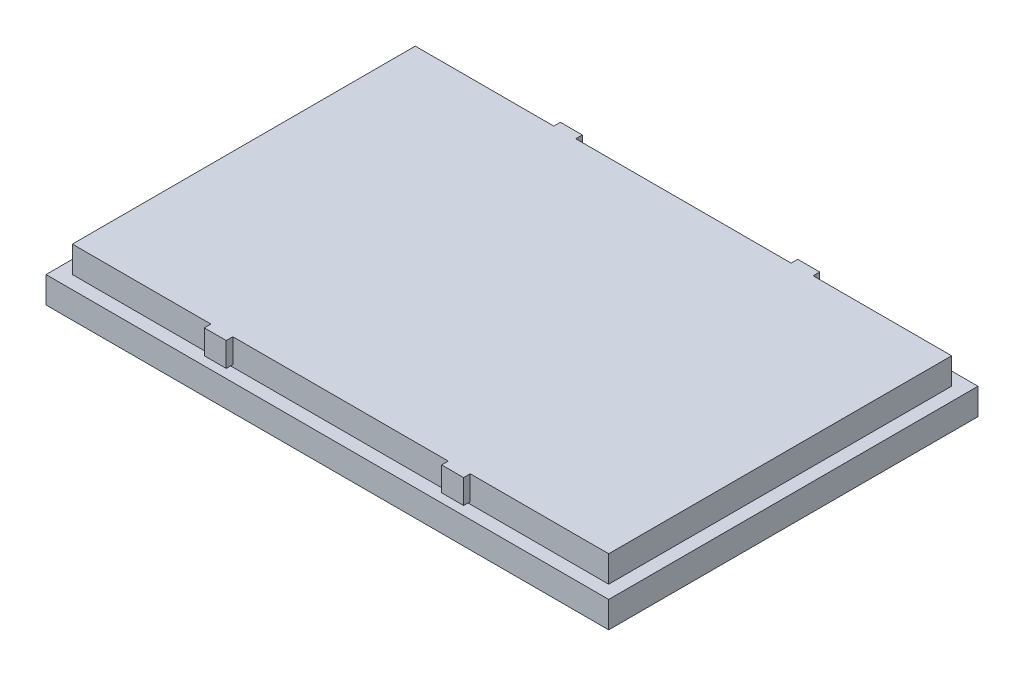
ISO-10303-21;
HEADER;
FILE_DESCRIPTION(('STEP AP214'),'2;1');
FILE_NAME('part.step','',(''),(''),'','','');
FILE_SCHEMA(('AUTOMOTIVE_DESIGN { 1 0 10303 214 1 1 1 1 }'));
ENDSEC;
DATA;
#1=APPLICATION_CONTEXT('core data for automotive mechanical design processes');
#2=APPLICATION_PROTOCOL_DEFINITION('international standard','automotive_design',2000,#1);
#3=PRODUCT_CONTEXT('',#1,'mechanical');
#4=PRODUCT('Part','Part','',(#3));
#5=PRODUCT_RELATED_PRODUCT_CATEGORY('part','',(#4));
#6=PRODUCT_DEFINITION_FORMATION('','',#4);
#7=PRODUCT_DEFINITION_CONTEXT('part definition',#1,'design');
#8=PRODUCT_DEFINITION('design','',#6,#7);
#9=PRODUCT_DEFINITION_SHAPE('','',#8);
#10=(LENGTH_UNIT() NAMED_UNIT(*) SI_UNIT(.MILLI.,.METRE.));
#11=(NAMED_UNIT(*) PLANE_ANGLE_UNIT() SI_UNIT($,.RADIAN.));
#12=(NAMED_UNIT(*) SI_UNIT($,.STERADIAN.) SOLID_ANGLE_UNIT());
#13=UNCERTAINTY_MEASURE_WITH_UNIT(LENGTH_MEASURE(1.E-05),#10,'distance_accuracy_value','');
#14=(GEOMETRIC_REPRESENTATION_CONTEXT(3) GLOBAL_UNCERTAINTY_ASSIGNED_CONTEXT((#13)) GLOBAL_UNIT_ASSIGNED_CONTEXT((#10,
#11,#12)) REPRESENTATION_CONTEXT('',''));
#15=CARTESIAN_POINT('',(0.,0.,0.));
#16=DIRECTION('',(0.,0.,1.));
#17=DIRECTION('',(1.,0.,0.));
#18=AXIS2_PLACEMENT_3D('',#15,#16,#17);
#19=CARTESIAN_POINT('',(14.,0.,-55.6));
#20=DIRECTION('',(0.,1.,0.));
#21=DIRECTION('',(0.,0.,1.));
#22=AXIS2_PLACEMENT_3D('',#19,#20,#21);
#23=PLANE('',#22);
#24=DIRECTION('',(0.,0.,-1.));
#25=VECTOR('',#24,1.);
#26=CARTESIAN_POINT('',(25.3,0.,-55.6));
#27=LINE('',#26,#25);
#28=CARTESIAN_POINT('',(25.3,0.,-71.6));
#29=VERTEX_POINT('',#28);
#30=CARTESIAN_POINT('',(25.3,0.,-72.4));
#31=VERTEX_POINT('',#30);
#32=EDGE_CURVE('E263',#29,#31,#27,.T.);
#33=ORIENTED_EDGE('',*,*,#32,.F.);
#34=DIRECTION('',(-1.,0.,0.));
#35=VECTOR('',#34,1.);
#36=CARTESIAN_POINT('',(14.,0.,-71.6));
#37=LINE('',#36,#35);
#38=CARTESIAN_POINT('',(28.3,0.,-71.6));
#39=VERTEX_POINT('',#38);
#40=EDGE_CURVE('E11',#39,#29,#37,.T.);
#41=ORIENTED_EDGE('',*,*,#40,.F.);
#42=DIRECTION('',(0.,0.,1.));
#43=VECTOR('',#42,1.);
#44=CARTESIAN_POINT('',(28.3,0.,-55.6));
#45=LINE('',#44,#43);
#46=CARTESIAN_POINT('',(28.3,0.,-72.4));
#47=VERTEX_POINT('',#46);
#48=EDGE_CURVE('E239',#47,#39,#45,.T.);
#49=ORIENTED_EDGE('',*,*,#48,.F.);
#50=DIRECTION('',(1.,0.,0.));
#51=VECTOR('',#50,1.);
#52=CARTESIAN_POINT('',(14.,0.,-72.4));
#53=LINE('',#52,#51);
#54=CARTESIAN_POINT('',(39.6,0.,-72.4));
#55=VERTEX_POINT('',#54);
#56=EDGE_CURVE('E463',#47,#55,#53,.T.);
#57=ORIENTED_EDGE('',*,*,#56,.T.);
#58=DIRECTION('',(0.,0.,-1.));
#59=VECTOR('',#58,1.);
#60=CARTESIAN_POINT('',(39.6,0.,-55.6));
#61=LINE('',#60,#59);
#62=CARTESIAN_POINT('',(39.6,0.,-55.6));
#63=VERTEX_POINT('',#62);
#64=EDGE_CURVE('E480',#63,#55,#61,.T.);
#65=ORIENTED_EDGE('',*,*,#64,.F.);
#66=DIRECTION('',(1.,0.,0.));
#67=VECTOR('',#66,1.);
#68=CARTESIAN_POINT('',(14.,0.,-55.6));
#69=LINE('',#68,#67);
#70=CARTESIAN_POINT('',(14.,0.,-55.6));
#71=VERTEX_POINT('',#70);
#72=EDGE_CURVE('E449',#71,#63,#69,.T.);
#73=ORIENTED_EDGE('',*,*,#72,.F.);
#74=DIRECTION('',(0.,0.,-1.));
#75=VECTOR('',#74,1.);
#76=CARTESIAN_POINT('',(14.,0.,-55.6));
#77=LINE('',#76,#75);
#78=CARTESIAN_POINT('',(14.,0.,-72.4));
#79=VERTEX_POINT('',#78);
#80=EDGE_CURVE('E484',#71,#79,#77,.T.);
#81=ORIENTED_EDGE('',*,*,#80,.T.);
#82=EDGE_CURVE('E464',#79,#31,#53,.T.);
#83=ORIENTED_EDGE('',*,*,#82,.T.);
#84=EDGE_LOOP('',(#33,#41,#49,#57,#65,#73,#81,#83));
#85=FACE_BOUND('',#84,.T.);
#86=ADVANCED_FACE('F47',(#85),#23,.F.);
#87=CARTESIAN_POINT('',(0.,0.,-72.4));
#88=DIRECTION('',(0.,0.,-1.));
#89=DIRECTION('',(-1.,0.,0.));
#90=AXIS2_PLACEMENT_3D('',#87,#88,#89);
#91=PLANE('',#90);
#92=DIRECTION('',(-1.,0.,0.));
#93=VECTOR('',#92,1.);
#94=CARTESIAN_POINT('',(0.,0.6,-72.4));
#95=LINE('',#94,#93);
#96=CARTESIAN_POINT('',(28.3,0.6,-72.4));
#97=VERTEX_POINT('',#96);
#98=CARTESIAN_POINT('',(25.3,0.6,-72.4));
#99=VERTEX_POINT('',#98);
#100=EDGE_CURVE('E249',#97,#99,#95,.T.);
#101=ORIENTED_EDGE('',*,*,#100,.T.);
#102=DIRECTION('',(0.,-1.,0.));
#103=VECTOR('',#102,1.);
#104=CARTESIAN_POINT('',(25.3,0.,-72.4));
#105=LINE('',#104,#103);
#106=EDGE_CURVE('E56',#99,#31,#105,.T.);
#107=ORIENTED_EDGE('',*,*,#106,.T.);
#108=ORIENTED_EDGE('',*,*,#82,.F.);
#109=DIRECTION('',(0.,-1.,0.));
#110=VECTOR('',#109,1.);
#111=CARTESIAN_POINT('',(14.,0.,-72.4));
#112=LINE('',#111,#110);
#113=CARTESIAN_POINT('',(14.,1.2,-72.4));
#114=VERTEX_POINT('',#113);
#115=EDGE_CURVE('E444',#114,#79,#112,.T.);
#116=ORIENTED_EDGE('',*,*,#115,.F.);
#117=DIRECTION('',(-1.,0.,0.));
#118=VECTOR('',#117,1.);
#119=CARTESIAN_POINT('',(14.,1.2,-72.4));
#120=LINE('',#119,#118);
#121=CARTESIAN_POINT('',(39.6,1.2,-72.4));
#122=VERTEX_POINT('',#121);
#123=EDGE_CURVE('E450',#122,#114,#120,.T.);
#124=ORIENTED_EDGE('',*,*,#123,.F.);
#125=DIRECTION('',(0.,1.,0.));
#126=VECTOR('',#125,1.);
#127=CARTESIAN_POINT('',(39.6,0.,-72.4));
#128=LINE('',#127,#126);
#129=EDGE_CURVE('E468',#55,#122,#128,.T.);
#130=ORIENTED_EDGE('',*,*,#129,.F.);
#131=ORIENTED_EDGE('',*,*,#56,.F.);
#132=DIRECTION('',(0.,1.,0.));
#133=VECTOR('',#132,1.);
#134=CARTESIAN_POINT('',(28.3,0.,-72.4));
#135=LINE('',#134,#133);
#136=EDGE_CURVE('E518',#47,#97,#135,.T.);
#137=ORIENTED_EDGE('',*,*,#136,.T.);
#138=EDGE_LOOP('',(#101,#107,#108,#116,#124,#130,#131,#137));
#139=FACE_BOUND('',#138,.T.);
#140=ADVANCED_FACE('F523',(#139),#91,.T.);
#141=CARTESIAN_POINT('',(0.,0.,-56.2));
#142=DIRECTION('',(0.,0.,-1.));
#143=DIRECTION('',(-1.,0.,0.));
#144=AXIS2_PLACEMENT_3D('',#141,#142,#143);
#145=PLANE('',#144);
#146=DIRECTION('',(0.,-1.,0.));
#147=VECTOR('',#146,1.);
#148=CARTESIAN_POINT('',(31.7,0.,-56.2));
#149=LINE('',#148,#147);
#150=CARTESIAN_POINT('',(31.7,2.4,-56.2));
#151=VERTEX_POINT('',#150);
#152=CARTESIAN_POINT('',(31.7,1.3,-56.2));
#153=VERTEX_POINT('',#152);
#154=EDGE_CURVE('E299',#151,#153,#149,.T.);
#155=ORIENTED_EDGE('',*,*,#154,.F.);
#156=DIRECTION('',(-1.,0.,0.));
#157=VECTOR('',#156,1.);
#158=CARTESIAN_POINT('',(14.6,2.4,-56.2));
#159=LINE('',#158,#157);
#160=CARTESIAN_POINT('',(21.9,2.4,-56.2));
#161=VERTEX_POINT('',#160);
#162=EDGE_CURVE('E425',#151,#161,#159,.T.);
#163=ORIENTED_EDGE('',*,*,#162,.T.);
#164=DIRECTION('',(0.,1.,0.));
#165=VECTOR('',#164,1.);
#166=CARTESIAN_POINT('',(21.9,0.,-56.2));
#167=LINE('',#166,#165);
#168=CARTESIAN_POINT('',(21.9,1.3,-56.2));
#169=VERTEX_POINT('',#168);
#170=EDGE_CURVE('E367',#169,#161,#167,.T.);
#171=ORIENTED_EDGE('',*,*,#170,.F.);
#172=DIRECTION('',(1.,0.,0.));
#173=VECTOR('',#172,1.);
#174=CARTESIAN_POINT('',(0.,1.3,-56.2));
#175=LINE('',#174,#173);
#176=CARTESIAN_POINT('',(20.9,1.3,-56.2));
#177=VERTEX_POINT('',#176);
#178=EDGE_CURVE('E506',#177,#169,#175,.T.);
#179=ORIENTED_EDGE('',*,*,#178,.F.);
#180=DIRECTION('',(0.,-1.,0.));
#181=VECTOR('',#180,1.);
#182=CARTESIAN_POINT('',(20.9,0.,-56.2));
#183=LINE('',#182,#181);
#184=CARTESIAN_POINT('',(20.9,2.4,-56.2));
#185=VERTEX_POINT('',#184);
#186=EDGE_CURVE('E371',#185,#177,#183,.T.);
#187=ORIENTED_EDGE('',*,*,#186,.F.);
#188=CARTESIAN_POINT('',(14.6,2.4,-56.2));
#189=VERTEX_POINT('',#188);
#190=EDGE_CURVE('E420',#185,#189,#159,.T.);
#191=ORIENTED_EDGE('',*,*,#190,.T.);
#192=DIRECTION('',(0.,-1.,0.));
#193=VECTOR('',#192,1.);
#194=CARTESIAN_POINT('',(14.6,1.19,-56.2));
#195=LINE('',#194,#193);
#196=CARTESIAN_POINT('',(14.6,1.2,-56.2));
#197=VERTEX_POINT('',#196);
#198=EDGE_CURVE('E412',#189,#197,#195,.T.);
#199=ORIENTED_EDGE('',*,*,#198,.T.);
#200=DIRECTION('',(1.,0.,0.));
#201=VECTOR('',#200,1.);
#202=CARTESIAN_POINT('',(14.,1.2,-56.2));
#203=LINE('',#202,#201);
#204=CARTESIAN_POINT('',(39.,1.2,-56.2));
#205=VERTEX_POINT('',#204);
#206=EDGE_CURVE('E499',#197,#205,#203,.T.);
#207=ORIENTED_EDGE('',*,*,#206,.T.);
#208=DIRECTION('',(0.,1.,0.));
#209=VECTOR('',#208,1.);
#210=CARTESIAN_POINT('',(39.,1.19,-56.2));
#211=LINE('',#210,#209);
#212=CARTESIAN_POINT('',(39.,2.4,-56.2));
#213=VERTEX_POINT('',#212);
#214=EDGE_CURVE('E416',#205,#213,#211,.T.);
#215=ORIENTED_EDGE('',*,*,#214,.T.);
#216=CARTESIAN_POINT('',(32.7,2.4,-56.2));
#217=VERTEX_POINT('',#216);
#218=EDGE_CURVE('E421',#213,#217,#159,.T.);
#219=ORIENTED_EDGE('',*,*,#218,.T.);
#220=DIRECTION('',(0.,1.,0.));
#221=VECTOR('',#220,1.);
#222=CARTESIAN_POINT('',(32.7,0.,-56.2));
#223=LINE('',#222,#221);
#224=CARTESIAN_POINT('',(32.7,1.3,-56.2));
#225=VERTEX_POINT('',#224);
#226=EDGE_CURVE('E295',#225,#217,#223,.T.);
#227=ORIENTED_EDGE('',*,*,#226,.F.);
#228=DIRECTION('',(1.,0.,0.));
#229=VECTOR('',#228,1.);
#230=CARTESIAN_POINT('',(0.,1.3,-56.2));
#231=LINE('',#230,#229);
#232=EDGE_CURVE('E71',#153,#225,#231,.T.);
#233=ORIENTED_EDGE('',*,*,#232,.F.);
#234=EDGE_LOOP('',(#155,#163,#171,#179,#187,#191,#199,#207,#215,#219,#227,#233));
#235=FACE_BOUND('',#234,.T.);
#236=ADVANCED_FACE('F565',(#235),#145,.F.);
#237=CARTESIAN_POINT('',(0.,0.,-71.8));
#238=DIRECTION('',(0.,0.,-1.));
#239=DIRECTION('',(-1.,0.,0.));
#240=AXIS2_PLACEMENT_3D('',#237,#238,#239);
#241=PLANE('',#240);
#242=DIRECTION('',(-1.,0.,0.));
#243=VECTOR('',#242,1.);
#244=CARTESIAN_POINT('',(14.6,2.4,-71.8));
#245=LINE('',#244,#243);
#246=CARTESIAN_POINT('',(31.7,2.4,-71.8));
#247=VERTEX_POINT('',#246);
#248=CARTESIAN_POINT('',(21.9,2.4,-71.8));
#249=VERTEX_POINT('',#248);
#250=EDGE_CURVE('E436',#247,#249,#245,.T.);
#251=ORIENTED_EDGE('',*,*,#250,.F.);
#252=DIRECTION('',(0.,-1.,0.));
#253=VECTOR('',#252,1.);
#254=CARTESIAN_POINT('',(31.7,0.,-71.8));
#255=LINE('',#254,#253);
#256=CARTESIAN_POINT('',(31.7,1.3,-71.8));
#257=VERTEX_POINT('',#256);
#258=EDGE_CURVE('E334',#247,#257,#255,.T.);
#259=ORIENTED_EDGE('',*,*,#258,.T.);
#260=DIRECTION('',(1.,0.,0.));
#261=VECTOR('',#260,1.);
#262=CARTESIAN_POINT('',(0.,1.3,-71.8));
#263=LINE('',#262,#261);
#264=CARTESIAN_POINT('',(32.7,1.3,-71.8));
#265=VERTEX_POINT('',#264);
#266=EDGE_CURVE('E510',#257,#265,#263,.T.);
#267=ORIENTED_EDGE('',*,*,#266,.T.);
#268=DIRECTION('',(0.,1.,0.));
#269=VECTOR('',#268,1.);
#270=CARTESIAN_POINT('',(32.7,0.,-71.8));
#271=LINE('',#270,#269);
#272=CARTESIAN_POINT('',(32.7,2.4,-71.8));
#273=VERTEX_POINT('',#272);
#274=EDGE_CURVE('E330',#265,#273,#271,.T.);
#275=ORIENTED_EDGE('',*,*,#274,.T.);
#276=CARTESIAN_POINT('',(39.,2.4,-71.8));
#277=VERTEX_POINT('',#276);
#278=EDGE_CURVE('E417',#277,#273,#245,.T.);
#279=ORIENTED_EDGE('',*,*,#278,.F.);
#280=DIRECTION('',(0.,1.,0.));
#281=VECTOR('',#280,1.);
#282=CARTESIAN_POINT('',(39.,1.19,-71.8));
#283=LINE('',#282,#281);
#284=CARTESIAN_POINT('',(39.,1.2,-71.8));
#285=VERTEX_POINT('',#284);
#286=EDGE_CURVE('E429',#285,#277,#283,.T.);
#287=ORIENTED_EDGE('',*,*,#286,.F.);
#288=DIRECTION('',(1.,0.,0.));
#289=VECTOR('',#288,1.);
#290=CARTESIAN_POINT('',(14.,1.2,-71.8));
#291=LINE('',#290,#289);
#292=CARTESIAN_POINT('',(14.6,1.2,-71.8));
#293=VERTEX_POINT('',#292);
#294=EDGE_CURVE('E488',#293,#285,#291,.T.);
#295=ORIENTED_EDGE('',*,*,#294,.F.);
#296=DIRECTION('',(0.,-1.,0.));
#297=VECTOR('',#296,1.);
#298=CARTESIAN_POINT('',(14.6,1.19,-71.8));
#299=LINE('',#298,#297);
#300=CARTESIAN_POINT('',(14.6,2.4,-71.8));
#301=VERTEX_POINT('',#300);
#302=EDGE_CURVE('E411',#301,#293,#299,.T.);
#303=ORIENTED_EDGE('',*,*,#302,.F.);
#304=CARTESIAN_POINT('',(20.9,2.4,-71.8));
#305=VERTEX_POINT('',#304);
#306=EDGE_CURVE('E432',#305,#301,#245,.T.);
#307=ORIENTED_EDGE('',*,*,#306,.F.);
#308=DIRECTION('',(0.,-1.,0.));
#309=VECTOR('',#308,1.);
#310=CARTESIAN_POINT('',(20.9,0.,-71.8));
#311=LINE('',#310,#309);
#312=CARTESIAN_POINT('',(20.9,1.3,-71.8));
#313=VERTEX_POINT('',#312);
#314=EDGE_CURVE('E407',#305,#313,#311,.T.);
#315=ORIENTED_EDGE('',*,*,#314,.T.);
#316=DIRECTION('',(1.,0.,0.));
#317=VECTOR('',#316,1.);
#318=CARTESIAN_POINT('',(0.,1.3,-71.8));
#319=LINE('',#318,#317);
#320=CARTESIAN_POINT('',(21.9,1.3,-71.8));
#321=VERTEX_POINT('',#320);
#322=EDGE_CURVE('E502',#313,#321,#319,.T.);
#323=ORIENTED_EDGE('',*,*,#322,.T.);
#324=DIRECTION('',(0.,1.,0.));
#325=VECTOR('',#324,1.);
#326=CARTESIAN_POINT('',(21.9,0.,-71.8));
#327=LINE('',#326,#325);
#328=EDGE_CURVE('E403',#321,#249,#327,.T.);
#329=ORIENTED_EDGE('',*,*,#328,.T.);
#330=EDGE_LOOP('',(#251,#259,#267,#275,#279,#287,#295,#303,#307,#315,#323,#329));
#331=FACE_BOUND('',#330,.T.);
#332=ADVANCED_FACE('F561',(#331),#241,.T.);
#333=CARTESIAN_POINT('',(14.,1.2,-55.6));
#334=DIRECTION('',(0.,-1.,0.));
#335=DIRECTION('',(0.,0.,-1.));
#336=AXIS2_PLACEMENT_3D('',#333,#334,#335);
#337=PLANE('',#336);
#338=ORIENTED_EDGE('',*,*,#123,.T.);
#339=DIRECTION('',(0.,0.,-1.));
#340=VECTOR('',#339,1.);
#341=CARTESIAN_POINT('',(14.,1.2,-55.6));
#342=LINE('',#341,#340);
#343=CARTESIAN_POINT('',(14.,1.2,-55.6));
#344=VERTEX_POINT('',#343);
#345=EDGE_CURVE('E459',#344,#114,#342,.T.);
#346=ORIENTED_EDGE('',*,*,#345,.F.);
#347=DIRECTION('',(-1.,0.,0.));
#348=VECTOR('',#347,1.);
#349=CARTESIAN_POINT('',(14.,1.2,-55.6));
#350=LINE('',#349,#348);
#351=CARTESIAN_POINT('',(39.6,1.2,-55.6));
#352=VERTEX_POINT('',#351);
#353=EDGE_CURVE('E456',#352,#344,#350,.T.);
#354=ORIENTED_EDGE('',*,*,#353,.F.);
#355=DIRECTION('',(0.,0.,-1.));
#356=VECTOR('',#355,1.);
#357=CARTESIAN_POINT('',(39.6,1.2,-55.6));
#358=LINE('',#357,#356);
#359=EDGE_CURVE('E476',#352,#122,#358,.T.);
#360=ORIENTED_EDGE('',*,*,#359,.T.);
#361=EDGE_LOOP('',(#338,#346,#354,#360));
#362=FACE_BOUND('',#361,.T.);
#363=ORIENTED_EDGE('',*,*,#206,.F.);
#364=DIRECTION('',(0.,0.,1.));
#365=VECTOR('',#364,1.);
#366=CARTESIAN_POINT('',(14.6,1.2,-55.6));
#367=LINE('',#366,#365);
#368=EDGE_CURVE('E496',#293,#197,#367,.T.);
#369=ORIENTED_EDGE('',*,*,#368,.F.);
#370=ORIENTED_EDGE('',*,*,#294,.T.);
#371=DIRECTION('',(0.,0.,-1.));
#372=VECTOR('',#371,1.);
#373=CARTESIAN_POINT('',(39.,1.2,-55.6));
#374=LINE('',#373,#372);
#375=EDGE_CURVE('E492',#205,#285,#374,.T.);
#376=ORIENTED_EDGE('',*,*,#375,.F.);
#377=EDGE_LOOP('',(#363,#369,#370,#376));
#378=FACE_BOUND('',#377,.T.);
#379=ADVANCED_FACE('F537',(#362,#378),#337,.F.);
#380=CARTESIAN_POINT('',(14.,0.,-55.6));
#381=DIRECTION('',(1.,0.,0.));
#382=DIRECTION('',(0.,0.,-1.));
#383=AXIS2_PLACEMENT_3D('',#380,#381,#382);
#384=PLANE('',#383);
#385=ORIENTED_EDGE('',*,*,#115,.T.);
#386=ORIENTED_EDGE('',*,*,#80,.F.);
#387=DIRECTION('',(0.,-1.,0.));
#388=VECTOR('',#387,1.);
#389=CARTESIAN_POINT('',(14.,0.,-55.6));
#390=LINE('',#389,#388);
#391=EDGE_CURVE('E445',#344,#71,#390,.T.);
#392=ORIENTED_EDGE('',*,*,#391,.F.);
#393=ORIENTED_EDGE('',*,*,#345,.T.);
#394=EDGE_LOOP('',(#385,#386,#392,#393));
#395=FACE_BOUND('',#394,.T.);
#396=ADVANCED_FACE('F49',(#395),#384,.F.);
#397=CARTESIAN_POINT('',(39.6,0.,-55.6));
#398=DIRECTION('',(-1.,0.,0.));
#399=DIRECTION('',(0.,0.,1.));
#400=AXIS2_PLACEMENT_3D('',#397,#398,#399);
#401=PLANE('',#400);
#402=ORIENTED_EDGE('',*,*,#129,.T.);
#403=ORIENTED_EDGE('',*,*,#359,.F.);
#404=DIRECTION('',(0.,1.,0.));
#405=VECTOR('',#404,1.);
#406=CARTESIAN_POINT('',(39.6,0.,-55.6));
#407=LINE('',#406,#405);
#408=EDGE_CURVE('E453',#63,#352,#407,.T.);
#409=ORIENTED_EDGE('',*,*,#408,.F.);
#410=ORIENTED_EDGE('',*,*,#64,.T.);
#411=EDGE_LOOP('',(#402,#403,#409,#410));
#412=FACE_BOUND('',#411,.T.);
#413=ADVANCED_FACE('F543',(#412),#401,.F.);
#414=CARTESIAN_POINT('',(0.,0.,-55.6));
#415=DIRECTION('',(0.,0.,-1.));
#416=DIRECTION('',(-1.,0.,0.));
#417=AXIS2_PLACEMENT_3D('',#414,#415,#416);
#418=PLANE('',#417);
#419=ORIENTED_EDGE('',*,*,#391,.T.);
#420=ORIENTED_EDGE('',*,*,#72,.T.);
#421=ORIENTED_EDGE('',*,*,#408,.T.);
#422=ORIENTED_EDGE('',*,*,#353,.T.);
#423=EDGE_LOOP('',(#419,#420,#421,#422));
#424=FACE_BOUND('',#423,.T.);
#425=ADVANCED_FACE('F616',(#424),#418,.F.);
#426=CARTESIAN_POINT('',(14.6,1.19,-56.2));
#427=DIRECTION('',(1.,0.,0.));
#428=DIRECTION('',(0.,0.,-1.));
#429=AXIS2_PLACEMENT_3D('',#426,#427,#428);
#430=PLANE('',#429);
#431=ORIENTED_EDGE('',*,*,#302,.T.);
#432=ORIENTED_EDGE('',*,*,#368,.T.);
#433=ORIENTED_EDGE('',*,*,#198,.F.);
#434=DIRECTION('',(0.,0.,-1.));
#435=VECTOR('',#434,1.);
#436=CARTESIAN_POINT('',(14.6,2.4,-56.2));
#437=LINE('',#436,#435);
#438=EDGE_CURVE('E424',#189,#301,#437,.T.);
#439=ORIENTED_EDGE('',*,*,#438,.T.);
#440=EDGE_LOOP('',(#431,#432,#433,#439));
#441=FACE_BOUND('',#440,.T.);
#442=ADVANCED_FACE('F558',(#441),#430,.F.);
#443=CARTESIAN_POINT('',(39.,1.19,-56.2));
#444=DIRECTION('',(-1.,0.,0.));
#445=DIRECTION('',(0.,0.,1.));
#446=AXIS2_PLACEMENT_3D('',#443,#444,#445);
#447=PLANE('',#446);
#448=ORIENTED_EDGE('',*,*,#214,.F.);
#449=ORIENTED_EDGE('',*,*,#375,.T.);
#450=ORIENTED_EDGE('',*,*,#286,.T.);
#451=DIRECTION('',(0.,0.,-1.));
#452=VECTOR('',#451,1.);
#453=CARTESIAN_POINT('',(39.,2.4,-56.2));
#454=LINE('',#453,#452);
#455=EDGE_CURVE('E440',#213,#277,#454,.T.);
#456=ORIENTED_EDGE('',*,*,#455,.F.);
#457=EDGE_LOOP('',(#448,#449,#450,#456));
#458=FACE_BOUND('',#457,.T.);
#459=ADVANCED_FACE('F624',(#458),#447,.F.);
#460=CARTESIAN_POINT('',(14.6,2.4,-56.2));
#461=DIRECTION('',(0.,-1.,0.));
#462=DIRECTION('',(0.,0.,-1.));
#463=AXIS2_PLACEMENT_3D('',#460,#461,#462);
#464=PLANE('',#463);
#465=ORIENTED_EDGE('',*,*,#162,.F.);
#466=DIRECTION('',(0.,0.,-1.));
#467=VECTOR('',#466,1.);
#468=CARTESIAN_POINT('',(31.7,2.4,-55.9));
#469=LINE('',#468,#467);
#470=CARTESIAN_POINT('',(31.7,2.4,-55.9));
#471=VERTEX_POINT('',#470);
#472=EDGE_CURVE('E279',#471,#151,#469,.T.);
#473=ORIENTED_EDGE('',*,*,#472,.F.);
#474=DIRECTION('',(-1.,0.,0.));
#475=VECTOR('',#474,1.);
#476=CARTESIAN_POINT('',(31.7,2.4,-55.9));
#477=LINE('',#476,#475);
#478=CARTESIAN_POINT('',(32.7,2.4,-55.9));
#479=VERTEX_POINT('',#478);
#480=EDGE_CURVE('E276',#479,#471,#477,.T.);
#481=ORIENTED_EDGE('',*,*,#480,.F.);
#482=DIRECTION('',(0.,0.,-1.));
#483=VECTOR('',#482,1.);
#484=CARTESIAN_POINT('',(32.7,2.4,-55.9));
#485=LINE('',#484,#483);
#486=EDGE_CURVE('E283',#479,#217,#485,.T.);
#487=ORIENTED_EDGE('',*,*,#486,.T.);
#488=ORIENTED_EDGE('',*,*,#218,.F.);
#489=ORIENTED_EDGE('',*,*,#455,.T.);
#490=ORIENTED_EDGE('',*,*,#278,.T.);
#491=DIRECTION('',(0.,0.,-1.));
#492=VECTOR('',#491,1.);
#493=CARTESIAN_POINT('',(32.7,2.4,-71.79));
#494=LINE('',#493,#492);
#495=CARTESIAN_POINT('',(32.7,2.4,-72.1));
#496=VERTEX_POINT('',#495);
#497=EDGE_CURVE('E321',#273,#496,#494,.T.);
#498=ORIENTED_EDGE('',*,*,#497,.T.);
#499=DIRECTION('',(-1.,0.,0.));
#500=VECTOR('',#499,1.);
#501=CARTESIAN_POINT('',(31.7,2.4,-72.1));
#502=LINE('',#501,#500);
#503=CARTESIAN_POINT('',(31.7,2.4,-72.1));
#504=VERTEX_POINT('',#503);
#505=EDGE_CURVE('E314',#496,#504,#502,.T.);
#506=ORIENTED_EDGE('',*,*,#505,.T.);
#507=DIRECTION('',(0.,0.,-1.));
#508=VECTOR('',#507,1.);
#509=CARTESIAN_POINT('',(31.7,2.4,-71.79));
#510=LINE('',#509,#508);
#511=EDGE_CURVE('E318',#247,#504,#510,.T.);
#512=ORIENTED_EDGE('',*,*,#511,.F.);
#513=ORIENTED_EDGE('',*,*,#250,.T.);
#514=DIRECTION('',(0.,0.,-1.));
#515=VECTOR('',#514,1.);
#516=CARTESIAN_POINT('',(21.9,2.4,-71.79));
#517=LINE('',#516,#515);
#518=CARTESIAN_POINT('',(21.9,2.4,-72.1));
#519=VERTEX_POINT('',#518);
#520=EDGE_CURVE('E394',#249,#519,#517,.T.);
#521=ORIENTED_EDGE('',*,*,#520,.T.);
#522=DIRECTION('',(-1.,0.,0.));
#523=VECTOR('',#522,1.);
#524=CARTESIAN_POINT('',(20.9,2.4,-72.1));
#525=LINE('',#524,#523);
#526=CARTESIAN_POINT('',(20.9,2.4,-72.1));
#527=VERTEX_POINT('',#526);
#528=EDGE_CURVE('E387',#519,#527,#525,.T.);
#529=ORIENTED_EDGE('',*,*,#528,.T.);
#530=DIRECTION('',(0.,0.,-1.));
#531=VECTOR('',#530,1.);
#532=CARTESIAN_POINT('',(20.9,2.4,-71.79));
#533=LINE('',#532,#531);
#534=EDGE_CURVE('E391',#305,#527,#533,.T.);
#535=ORIENTED_EDGE('',*,*,#534,.F.);
#536=ORIENTED_EDGE('',*,*,#306,.T.);
#537=ORIENTED_EDGE('',*,*,#438,.F.);
#538=ORIENTED_EDGE('',*,*,#190,.F.);
#539=DIRECTION('',(0.,0.,-1.));
#540=VECTOR('',#539,1.);
#541=CARTESIAN_POINT('',(20.9,2.4,-55.9));
#542=LINE('',#541,#540);
#543=CARTESIAN_POINT('',(20.9,2.4,-55.9));
#544=VERTEX_POINT('',#543);
#545=EDGE_CURVE('E351',#544,#185,#542,.T.);
#546=ORIENTED_EDGE('',*,*,#545,.F.);
#547=DIRECTION('',(-1.,0.,0.));
#548=VECTOR('',#547,1.);
#549=CARTESIAN_POINT('',(20.9,2.4,-55.9));
#550=LINE('',#549,#548);
#551=CARTESIAN_POINT('',(21.9,2.4,-55.9));
#552=VERTEX_POINT('',#551);
#553=EDGE_CURVE('E348',#552,#544,#550,.T.);
#554=ORIENTED_EDGE('',*,*,#553,.F.);
#555=DIRECTION('',(0.,0.,-1.));
#556=VECTOR('',#555,1.);
#557=CARTESIAN_POINT('',(21.9,2.4,-55.9));
#558=LINE('',#557,#556);
#559=EDGE_CURVE('E355',#552,#161,#558,.T.);
#560=ORIENTED_EDGE('',*,*,#559,.T.);
#561=EDGE_LOOP('',(#465,#473,#481,#487,#488,#489,#490,#498,#506,#512,#513,#521,#529,#535,#536,
#537,#538,#546,#554,#560));
#562=FACE_BOUND('',#561,.T.);
#563=ADVANCED_FACE('F552',(#562),#464,.F.);
#564=CARTESIAN_POINT('',(20.9,1.3,-71.79));
#565=DIRECTION('',(1.,0.,0.));
#566=DIRECTION('',(0.,0.,-1.));
#567=AXIS2_PLACEMENT_3D('',#564,#565,#566);
#568=PLANE('',#567);
#569=ORIENTED_EDGE('',*,*,#314,.F.);
#570=ORIENTED_EDGE('',*,*,#534,.T.);
#571=DIRECTION('',(0.,-1.,0.));
#572=VECTOR('',#571,1.);
#573=CARTESIAN_POINT('',(20.9,1.3,-72.1));
#574=LINE('',#573,#572);
#575=CARTESIAN_POINT('',(20.9,1.3,-72.1));
#576=VERTEX_POINT('',#575);
#577=EDGE_CURVE('E375',#527,#576,#574,.T.);
#578=ORIENTED_EDGE('',*,*,#577,.T.);
#579=DIRECTION('',(0.,0.,-1.));
#580=VECTOR('',#579,1.);
#581=CARTESIAN_POINT('',(20.9,1.3,-71.79));
#582=LINE('',#581,#580);
#583=EDGE_CURVE('E400',#313,#576,#582,.T.);
#584=ORIENTED_EDGE('',*,*,#583,.F.);
#585=EDGE_LOOP('',(#569,#570,#578,#584));
#586=FACE_BOUND('',#585,.T.);
#587=ADVANCED_FACE('F630',(#586),#568,.F.);
#588=CARTESIAN_POINT('',(20.9,1.3,-71.79));
#589=DIRECTION('',(0.,1.,0.));
#590=DIRECTION('',(0.,0.,1.));
#591=AXIS2_PLACEMENT_3D('',#588,#589,#590);
#592=PLANE('',#591);
#593=ORIENTED_EDGE('',*,*,#322,.F.);
#594=ORIENTED_EDGE('',*,*,#583,.T.);
#595=DIRECTION('',(1.,0.,0.));
#596=VECTOR('',#595,1.);
#597=CARTESIAN_POINT('',(20.9,1.3,-72.1));
#598=LINE('',#597,#596);
#599=CARTESIAN_POINT('',(21.9,1.3,-72.1));
#600=VERTEX_POINT('',#599);
#601=EDGE_CURVE('E379',#576,#600,#598,.T.);
#602=ORIENTED_EDGE('',*,*,#601,.T.);
#603=DIRECTION('',(0.,0.,-1.));
#604=VECTOR('',#603,1.);
#605=CARTESIAN_POINT('',(21.9,1.3,-71.79));
#606=LINE('',#605,#604);
#607=EDGE_CURVE('E397',#321,#600,#606,.T.);
#608=ORIENTED_EDGE('',*,*,#607,.F.);
#609=EDGE_LOOP('',(#593,#594,#602,#608));
#610=FACE_BOUND('',#609,.T.);
#611=ADVANCED_FACE('F637',(#610),#592,.F.);
#612=CARTESIAN_POINT('',(21.9,1.3,-71.79));
#613=DIRECTION('',(-1.,0.,0.));
#614=DIRECTION('',(0.,0.,1.));
#615=AXIS2_PLACEMENT_3D('',#612,#613,#614);
#616=PLANE('',#615);
#617=ORIENTED_EDGE('',*,*,#328,.F.);
#618=ORIENTED_EDGE('',*,*,#607,.T.);
#619=DIRECTION('',(0.,1.,0.));
#620=VECTOR('',#619,1.);
#621=CARTESIAN_POINT('',(21.9,1.3,-72.1));
#622=LINE('',#621,#620);
#623=EDGE_CURVE('E383',#600,#519,#622,.T.);
#624=ORIENTED_EDGE('',*,*,#623,.T.);
#625=ORIENTED_EDGE('',*,*,#520,.F.);
#626=EDGE_LOOP('',(#617,#618,#624,#625));
#627=FACE_BOUND('',#626,.T.);
#628=ADVANCED_FACE('F641',(#627),#616,.F.);
#629=CARTESIAN_POINT('',(0.,0.,-72.1));
#630=DIRECTION('',(0.,0.,-1.));
#631=DIRECTION('',(-1.,0.,0.));
#632=AXIS2_PLACEMENT_3D('',#629,#630,#631);
#633=PLANE('',#632);
#634=ORIENTED_EDGE('',*,*,#577,.F.);
#635=ORIENTED_EDGE('',*,*,#528,.F.);
#636=ORIENTED_EDGE('',*,*,#623,.F.);
#637=ORIENTED_EDGE('',*,*,#601,.F.);
#638=EDGE_LOOP('',(#634,#635,#636,#637));
#639=FACE_BOUND('',#638,.T.);
#640=ADVANCED_FACE('F645',(#639),#633,.T.);
#641=CARTESIAN_POINT('',(20.9,1.3,-55.9));
#642=DIRECTION('',(0.,1.,0.));
#643=DIRECTION('',(0.,0.,1.));
#644=AXIS2_PLACEMENT_3D('',#641,#642,#643);
#645=PLANE('',#644);
#646=DIRECTION('',(0.,0.,-1.));
#647=VECTOR('',#646,1.);
#648=CARTESIAN_POINT('',(20.9,1.3,-55.9));
#649=LINE('',#648,#647);
#650=CARTESIAN_POINT('',(20.9,1.3,-55.9));
#651=VERTEX_POINT('',#650);
#652=EDGE_CURVE('E363',#651,#177,#649,.T.);
#653=ORIENTED_EDGE('',*,*,#652,.T.);
#654=ORIENTED_EDGE('',*,*,#178,.T.);
#655=DIRECTION('',(0.,0.,-1.));
#656=VECTOR('',#655,1.);
#657=CARTESIAN_POINT('',(21.9,1.3,-55.9));
#658=LINE('',#657,#656);
#659=CARTESIAN_POINT('',(21.9,1.3,-55.9));
#660=VERTEX_POINT('',#659);
#661=EDGE_CURVE('E359',#660,#169,#658,.T.);
#662=ORIENTED_EDGE('',*,*,#661,.F.);
#663=DIRECTION('',(1.,0.,0.));
#664=VECTOR('',#663,1.);
#665=CARTESIAN_POINT('',(20.9,1.3,-55.9));
#666=LINE('',#665,#664);
#667=EDGE_CURVE('E342',#651,#660,#666,.T.);
#668=ORIENTED_EDGE('',*,*,#667,.F.);
#669=EDGE_LOOP('',(#653,#654,#662,#668));
#670=FACE_BOUND('',#669,.T.);
#671=ADVANCED_FACE('F649',(#670),#645,.F.);
#672=CARTESIAN_POINT('',(20.9,1.3,-55.9));
#673=DIRECTION('',(1.,0.,0.));
#674=DIRECTION('',(0.,0.,-1.));
#675=AXIS2_PLACEMENT_3D('',#672,#673,#674);
#676=PLANE('',#675);
#677=ORIENTED_EDGE('',*,*,#545,.T.);
#678=ORIENTED_EDGE('',*,*,#186,.T.);
#679=ORIENTED_EDGE('',*,*,#652,.F.);
#680=DIRECTION('',(0.,-1.,0.));
#681=VECTOR('',#680,1.);
#682=CARTESIAN_POINT('',(20.9,1.3,-55.9));
#683=LINE('',#682,#681);
#684=EDGE_CURVE('E338',#544,#651,#683,.T.);
#685=ORIENTED_EDGE('',*,*,#684,.F.);
#686=EDGE_LOOP('',(#677,#678,#679,#685));
#687=FACE_BOUND('',#686,.T.);
#688=ADVANCED_FACE('F573',(#687),#676,.F.);
#689=CARTESIAN_POINT('',(21.9,1.3,-55.9));
#690=DIRECTION('',(-1.,0.,0.));
#691=DIRECTION('',(0.,0.,1.));
#692=AXIS2_PLACEMENT_3D('',#689,#690,#691);
#693=PLANE('',#692);
#694=ORIENTED_EDGE('',*,*,#661,.T.);
#695=ORIENTED_EDGE('',*,*,#170,.T.);
#696=ORIENTED_EDGE('',*,*,#559,.F.);
#697=DIRECTION('',(0.,1.,0.));
#698=VECTOR('',#697,1.);
#699=CARTESIAN_POINT('',(21.9,1.3,-55.9));
#700=LINE('',#699,#698);
#701=EDGE_CURVE('E345',#660,#552,#700,.T.);
#702=ORIENTED_EDGE('',*,*,#701,.F.);
#703=EDGE_LOOP('',(#694,#695,#696,#702));
#704=FACE_BOUND('',#703,.T.);
#705=ADVANCED_FACE('F580',(#704),#693,.F.);
#706=CARTESIAN_POINT('',(0.,0.,-55.9));
#707=DIRECTION('',(0.,0.,-1.));
#708=DIRECTION('',(-1.,0.,0.));
#709=AXIS2_PLACEMENT_3D('',#706,#707,#708);
#710=PLANE('',#709);
#711=ORIENTED_EDGE('',*,*,#684,.T.);
#712=ORIENTED_EDGE('',*,*,#667,.T.);
#713=ORIENTED_EDGE('',*,*,#701,.T.);
#714=ORIENTED_EDGE('',*,*,#553,.T.);
#715=EDGE_LOOP('',(#711,#712,#713,#714));
#716=FACE_BOUND('',#715,.T.);
#717=ADVANCED_FACE('F575',(#716),#710,.F.);
#718=CARTESIAN_POINT('',(31.7,1.3,-71.79));
#719=DIRECTION('',(1.,0.,0.));
#720=DIRECTION('',(0.,0.,-1.));
#721=AXIS2_PLACEMENT_3D('',#718,#719,#720);
#722=PLANE('',#721);
#723=ORIENTED_EDGE('',*,*,#258,.F.);
#724=ORIENTED_EDGE('',*,*,#511,.T.);
#725=DIRECTION('',(0.,-1.,0.));
#726=VECTOR('',#725,1.);
#727=CARTESIAN_POINT('',(31.7,1.3,-72.1));
#728=LINE('',#727,#726);
#729=CARTESIAN_POINT('',(31.7,1.3,-72.1));
#730=VERTEX_POINT('',#729);
#731=EDGE_CURVE('E302',#504,#730,#728,.T.);
#732=ORIENTED_EDGE('',*,*,#731,.T.);
#733=DIRECTION('',(0.,0.,-1.));
#734=VECTOR('',#733,1.);
#735=CARTESIAN_POINT('',(31.7,1.3,-71.79));
#736=LINE('',#735,#734);
#737=EDGE_CURVE('E327',#257,#730,#736,.T.);
#738=ORIENTED_EDGE('',*,*,#737,.F.);
#739=EDGE_LOOP('',(#723,#724,#732,#738));
#740=FACE_BOUND('',#739,.T.);
#741=ADVANCED_FACE('F660',(#740),#722,.F.);
#742=CARTESIAN_POINT('',(31.7,1.3,-71.79));
#743=DIRECTION('',(0.,1.,0.));
#744=DIRECTION('',(0.,0.,1.));
#745=AXIS2_PLACEMENT_3D('',#742,#743,#744);
#746=PLANE('',#745);
#747=ORIENTED_EDGE('',*,*,#266,.F.);
#748=ORIENTED_EDGE('',*,*,#737,.T.);
#749=DIRECTION('',(1.,0.,0.));
#750=VECTOR('',#749,1.);
#751=CARTESIAN_POINT('',(31.7,1.3,-72.1));
#752=LINE('',#751,#750);
#753=CARTESIAN_POINT('',(32.7,1.3,-72.1));
#754=VERTEX_POINT('',#753);
#755=EDGE_CURVE('E306',#730,#754,#752,.T.);
#756=ORIENTED_EDGE('',*,*,#755,.T.);
#757=DIRECTION('',(0.,0.,-1.));
#758=VECTOR('',#757,1.);
#759=CARTESIAN_POINT('',(32.7,1.3,-71.79));
#760=LINE('',#759,#758);
#761=EDGE_CURVE('E324',#265,#754,#760,.T.);
#762=ORIENTED_EDGE('',*,*,#761,.F.);
#763=EDGE_LOOP('',(#747,#748,#756,#762));
#764=FACE_BOUND('',#763,.T.);
#765=ADVANCED_FACE('F663',(#764),#746,.F.);
#766=CARTESIAN_POINT('',(32.7,1.3,-71.79));
#767=DIRECTION('',(-1.,0.,0.));
#768=DIRECTION('',(0.,0.,1.));
#769=AXIS2_PLACEMENT_3D('',#766,#767,#768);
#770=PLANE('',#769);
#771=ORIENTED_EDGE('',*,*,#274,.F.);
#772=ORIENTED_EDGE('',*,*,#761,.T.);
#773=DIRECTION('',(0.,1.,0.));
#774=VECTOR('',#773,1.);
#775=CARTESIAN_POINT('',(32.7,1.3,-72.1));
#776=LINE('',#775,#774);
#777=EDGE_CURVE('E310',#754,#496,#776,.T.);
#778=ORIENTED_EDGE('',*,*,#777,.T.);
#779=ORIENTED_EDGE('',*,*,#497,.F.);
#780=EDGE_LOOP('',(#771,#772,#778,#779));
#781=FACE_BOUND('',#780,.T.);
#782=ADVANCED_FACE('F605',(#781),#770,.F.);
#783=CARTESIAN_POINT('',(0.,0.,-72.1));
#784=DIRECTION('',(0.,0.,-1.));
#785=DIRECTION('',(-1.,0.,0.));
#786=AXIS2_PLACEMENT_3D('',#783,#784,#785);
#787=PLANE('',#786);
#788=ORIENTED_EDGE('',*,*,#731,.F.);
#789=ORIENTED_EDGE('',*,*,#505,.F.);
#790=ORIENTED_EDGE('',*,*,#777,.F.);
#791=ORIENTED_EDGE('',*,*,#755,.F.);
#792=EDGE_LOOP('',(#788,#789,#790,#791));
#793=FACE_BOUND('',#792,.T.);
#794=ADVANCED_FACE('F598',(#793),#787,.T.);
#795=CARTESIAN_POINT('',(31.7,1.3,-55.9));
#796=DIRECTION('',(0.,1.,0.));
#797=DIRECTION('',(0.,0.,1.));
#798=AXIS2_PLACEMENT_3D('',#795,#796,#797);
#799=PLANE('',#798);
#800=DIRECTION('',(0.,0.,-1.));
#801=VECTOR('',#800,1.);
#802=CARTESIAN_POINT('',(31.7,1.3,-55.9));
#803=LINE('',#802,#801);
#804=CARTESIAN_POINT('',(31.7,1.3,-55.9));
#805=VERTEX_POINT('',#804);
#806=EDGE_CURVE('E291',#805,#153,#803,.T.);
#807=ORIENTED_EDGE('',*,*,#806,.T.);
#808=ORIENTED_EDGE('',*,*,#232,.T.);
#809=DIRECTION('',(0.,0.,-1.));
#810=VECTOR('',#809,1.);
#811=CARTESIAN_POINT('',(32.7,1.3,-55.9));
#812=LINE('',#811,#810);
#813=CARTESIAN_POINT('',(32.7,1.3,-55.9));
#814=VERTEX_POINT('',#813);
#815=EDGE_CURVE('E287',#814,#225,#812,.T.);
#816=ORIENTED_EDGE('',*,*,#815,.F.);
#817=DIRECTION('',(1.,0.,0.));
#818=VECTOR('',#817,1.);
#819=CARTESIAN_POINT('',(31.7,1.3,-55.9));
#820=LINE('',#819,#818);
#821=EDGE_CURVE('E270',#805,#814,#820,.T.);
#822=ORIENTED_EDGE('',*,*,#821,.F.);
#823=EDGE_LOOP('',(#807,#808,#816,#822));
#824=FACE_BOUND('',#823,.T.);
#825=ADVANCED_FACE('F596',(#824),#799,.F.);
#826=CARTESIAN_POINT('',(31.7,1.3,-55.9));
#827=DIRECTION('',(1.,0.,0.));
#828=DIRECTION('',(0.,0.,-1.));
#829=AXIS2_PLACEMENT_3D('',#826,#827,#828);
#830=PLANE('',#829);
#831=ORIENTED_EDGE('',*,*,#472,.T.);
#832=ORIENTED_EDGE('',*,*,#154,.T.);
#833=ORIENTED_EDGE('',*,*,#806,.F.);
#834=DIRECTION('',(0.,-1.,0.));
#835=VECTOR('',#834,1.);
#836=CARTESIAN_POINT('',(31.7,1.3,-55.9));
#837=LINE('',#836,#835);
#838=EDGE_CURVE('E266',#471,#805,#837,.T.);
#839=ORIENTED_EDGE('',*,*,#838,.F.);
#840=EDGE_LOOP('',(#831,#832,#833,#839));
#841=FACE_BOUND('',#840,.T.);
#842=ADVANCED_FACE('F586',(#841),#830,.F.);
#843=CARTESIAN_POINT('',(32.7,1.3,-55.9));
#844=DIRECTION('',(-1.,0.,0.));
#845=DIRECTION('',(0.,0.,1.));
#846=AXIS2_PLACEMENT_3D('',#843,#844,#845);
#847=PLANE('',#846);
#848=ORIENTED_EDGE('',*,*,#815,.T.);
#849=ORIENTED_EDGE('',*,*,#226,.T.);
#850=ORIENTED_EDGE('',*,*,#486,.F.);
#851=DIRECTION('',(0.,1.,0.));
#852=VECTOR('',#851,1.);
#853=CARTESIAN_POINT('',(32.7,1.3,-55.9));
#854=LINE('',#853,#852);
#855=EDGE_CURVE('E273',#814,#479,#854,.T.);
#856=ORIENTED_EDGE('',*,*,#855,.F.);
#857=EDGE_LOOP('',(#848,#849,#850,#856));
#858=FACE_BOUND('',#857,.T.);
#859=ADVANCED_FACE('F594',(#858),#847,.F.);
#860=CARTESIAN_POINT('',(0.,0.,-55.9));
#861=DIRECTION('',(0.,0.,-1.));
#862=DIRECTION('',(-1.,0.,0.));
#863=AXIS2_PLACEMENT_3D('',#860,#861,#862);
#864=PLANE('',#863);
#865=ORIENTED_EDGE('',*,*,#838,.T.);
#866=ORIENTED_EDGE('',*,*,#821,.T.);
#867=ORIENTED_EDGE('',*,*,#855,.T.);
#868=ORIENTED_EDGE('',*,*,#480,.T.);
#869=EDGE_LOOP('',(#865,#866,#867,#868));
#870=FACE_BOUND('',#869,.T.);
#871=ADVANCED_FACE('F588',(#870),#864,.F.);
#872=CARTESIAN_POINT('',(0.,0.,-71.6));
#873=DIRECTION('',(0.,0.,-1.));
#874=DIRECTION('',(-1.,0.,0.));
#875=AXIS2_PLACEMENT_3D('',#872,#873,#874);
#876=PLANE('',#875);
#877=ORIENTED_EDGE('',*,*,#40,.T.);
#878=DIRECTION('',(0.,-1.,0.));
#879=VECTOR('',#878,1.);
#880=CARTESIAN_POINT('',(25.3,-0.1,-71.6));
#881=LINE('',#880,#879);
#882=CARTESIAN_POINT('',(25.3,0.6,-71.6));
#883=VERTEX_POINT('',#882);
#884=EDGE_CURVE('E245',#883,#29,#881,.T.);
#885=ORIENTED_EDGE('',*,*,#884,.F.);
#886=DIRECTION('',(-1.,0.,0.));
#887=VECTOR('',#886,1.);
#888=CARTESIAN_POINT('',(25.3,0.6,-71.6));
#889=LINE('',#888,#887);
#890=CARTESIAN_POINT('',(28.3,0.6,-71.6));
#891=VERTEX_POINT('',#890);
#892=EDGE_CURVE('E244',#891,#883,#889,.T.);
#893=ORIENTED_EDGE('',*,*,#892,.F.);
#894=DIRECTION('',(0.,1.,0.));
#895=VECTOR('',#894,1.);
#896=CARTESIAN_POINT('',(28.3,-0.1,-71.6));
#897=LINE('',#896,#895);
#898=EDGE_CURVE('E233',#39,#891,#897,.T.);
#899=ORIENTED_EDGE('',*,*,#898,.F.);
#900=EDGE_LOOP('',(#877,#885,#893,#899));
#901=FACE_BOUND('',#900,.T.);
#902=ADVANCED_FACE('F253',(#901),#876,.T.);
#903=CARTESIAN_POINT('',(25.3,-0.1,-71.6));
#904=DIRECTION('',(1.,0.,0.));
#905=DIRECTION('',(0.,0.,-1.));
#906=AXIS2_PLACEMENT_3D('',#903,#904,#905);
#907=PLANE('',#906);
#908=ORIENTED_EDGE('',*,*,#32,.T.);
#909=ORIENTED_EDGE('',*,*,#106,.F.);
#910=DIRECTION('',(0.,0.,-1.));
#911=VECTOR('',#910,1.);
#912=CARTESIAN_POINT('',(25.3,0.6,-71.6));
#913=LINE('',#912,#911);
#914=EDGE_CURVE('E63',#883,#99,#913,.T.);
#915=ORIENTED_EDGE('',*,*,#914,.F.);
#916=ORIENTED_EDGE('',*,*,#884,.T.);
#917=EDGE_LOOP('',(#908,#909,#915,#916));
#918=FACE_BOUND('',#917,.T.);
#919=ADVANCED_FACE('F743',(#918),#907,.T.);
#920=CARTESIAN_POINT('',(28.3,-0.1,-71.6));
#921=DIRECTION('',(-1.,0.,0.));
#922=DIRECTION('',(0.,0.,1.));
#923=AXIS2_PLACEMENT_3D('',#920,#921,#922);
#924=PLANE('',#923);
#925=ORIENTED_EDGE('',*,*,#48,.T.);
#926=ORIENTED_EDGE('',*,*,#898,.T.);
#927=DIRECTION('',(0.,0.,-1.));
#928=VECTOR('',#927,1.);
#929=CARTESIAN_POINT('',(28.3,0.6,-71.6));
#930=LINE('',#929,#928);
#931=EDGE_CURVE('E236',#891,#97,#930,.T.);
#932=ORIENTED_EDGE('',*,*,#931,.T.);
#933=ORIENTED_EDGE('',*,*,#136,.F.);
#934=EDGE_LOOP('',(#925,#926,#932,#933));
#935=FACE_BOUND('',#934,.T.);
#936=ADVANCED_FACE('F235',(#935),#924,.T.);
#937=CARTESIAN_POINT('',(25.3,0.6,-71.6));
#938=DIRECTION('',(0.,-1.,0.));
#939=DIRECTION('',(0.,0.,-1.));
#940=AXIS2_PLACEMENT_3D('',#937,#938,#939);
#941=PLANE('',#940);
#942=ORIENTED_EDGE('',*,*,#931,.F.);
#943=ORIENTED_EDGE('',*,*,#892,.T.);
#944=ORIENTED_EDGE('',*,*,#914,.T.);
#945=ORIENTED_EDGE('',*,*,#100,.F.);
#946=EDGE_LOOP('',(#942,#943,#944,#945));
#947=FACE_BOUND('',#946,.T.);
#948=ADVANCED_FACE('F247',(#947),#941,.T.);
#949=CLOSED_SHELL('',(#86,#140,#236,#332,#379,#396,#413,#425,#442,#459,#563,#587,#611,#628,#640,
#671,#688,#705,#717,#741,#765,#782,#794,#825,#842,#859,#871,#902,#919,#936,#948));
#950=MANIFOLD_SOLID_BREP('B2',#949);
#951=ADVANCED_BREP_SHAPE_REPRESENTATION('',(#18,#950),#14);
#952=SHAPE_DEFINITION_REPRESENTATION(#9,#951);
ENDSEC;
END-ISO-10303-21;
